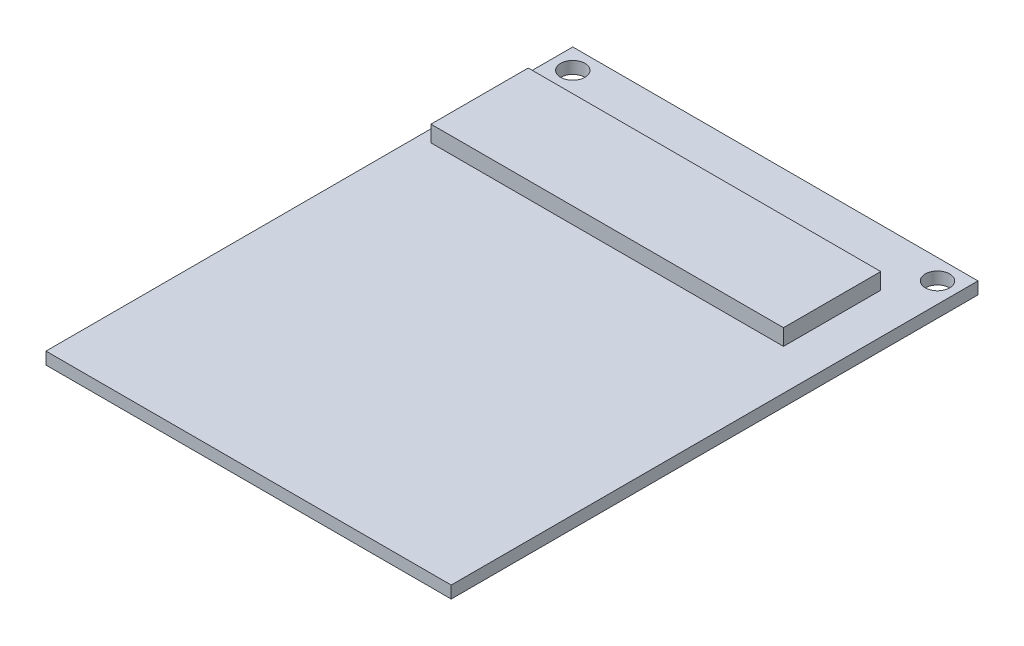
ISO-10303-21;
HEADER;
FILE_DESCRIPTION(('STEP AP214'),'2;1');
FILE_NAME('part.step','',(''),(''),'','','');
FILE_SCHEMA(('AUTOMOTIVE_DESIGN { 1 0 10303 214 1 1 1 1 }'));
ENDSEC;
DATA;
#1=APPLICATION_CONTEXT('core data for automotive mechanical design processes');
#2=APPLICATION_PROTOCOL_DEFINITION('international standard','automotive_design',2000,#1);
#3=PRODUCT_CONTEXT('',#1,'mechanical');
#4=PRODUCT('Part','Part','',(#3));
#5=PRODUCT_RELATED_PRODUCT_CATEGORY('part','',(#4));
#6=PRODUCT_DEFINITION_FORMATION('','',#4);
#7=PRODUCT_DEFINITION_CONTEXT('part definition',#1,'design');
#8=PRODUCT_DEFINITION('design','',#6,#7);
#9=PRODUCT_DEFINITION_SHAPE('','',#8);
#10=(LENGTH_UNIT() NAMED_UNIT(*) SI_UNIT(.MILLI.,.METRE.));
#11=(NAMED_UNIT(*) PLANE_ANGLE_UNIT() SI_UNIT($,.RADIAN.));
#12=(NAMED_UNIT(*) SI_UNIT($,.STERADIAN.) SOLID_ANGLE_UNIT());
#13=UNCERTAINTY_MEASURE_WITH_UNIT(LENGTH_MEASURE(1.E-05),#10,'distance_accuracy_value','');
#14=(GEOMETRIC_REPRESENTATION_CONTEXT(3) GLOBAL_UNCERTAINTY_ASSIGNED_CONTEXT((#13)) GLOBAL_UNIT_ASSIGNED_CONTEXT((#10,
#11,#12)) REPRESENTATION_CONTEXT('',''));
#15=CARTESIAN_POINT('',(0.,0.,0.));
#16=DIRECTION('',(0.,0.,1.));
#17=DIRECTION('',(1.,0.,0.));
#18=AXIS2_PLACEMENT_3D('',#15,#16,#17);
#19=CARTESIAN_POINT('',(0.,1.5,0.));
#20=DIRECTION('',(0.,0.,-1.));
#21=DIRECTION('',(-1.,0.,0.));
#22=AXIS2_PLACEMENT_3D('',#19,#20,#21);
#23=PLANE('',#22);
#24=DIRECTION('',(1.,0.,0.));
#25=VECTOR('',#24,1.);
#26=CARTESIAN_POINT('',(0.,0.,0.));
#27=LINE('',#26,#25);
#28=CARTESIAN_POINT('',(0.,0.,0.));
#29=VERTEX_POINT('',#28);
#30=CARTESIAN_POINT('',(50.,0.,0.));
#31=VERTEX_POINT('',#30);
#32=EDGE_CURVE('E122',#29,#31,#27,.T.);
#33=ORIENTED_EDGE('',*,*,#32,.T.);
#34=DIRECTION('',(0.,-1.,0.));
#35=VECTOR('',#34,1.);
#36=CARTESIAN_POINT('',(50.,1.5,0.));
#37=LINE('',#36,#35);
#38=CARTESIAN_POINT('',(50.,1.5,0.));
#39=VERTEX_POINT('',#38);
#40=EDGE_CURVE('E11',#39,#31,#37,.T.);
#41=ORIENTED_EDGE('',*,*,#40,.F.);
#42=DIRECTION('',(1.,0.,0.));
#43=VECTOR('',#42,1.);
#44=CARTESIAN_POINT('',(0.,1.5,0.));
#45=LINE('',#44,#43);
#46=CARTESIAN_POINT('',(0.,1.5,0.));
#47=VERTEX_POINT('',#46);
#48=EDGE_CURVE('E155',#47,#39,#45,.T.);
#49=ORIENTED_EDGE('',*,*,#48,.F.);
#50=DIRECTION('',(0.,-1.,0.));
#51=VECTOR('',#50,1.);
#52=CARTESIAN_POINT('',(0.,1.5,0.));
#53=LINE('',#52,#51);
#54=EDGE_CURVE('E62',#47,#29,#53,.T.);
#55=ORIENTED_EDGE('',*,*,#54,.T.);
#56=EDGE_LOOP('',(#33,#41,#49,#55));
#57=FACE_BOUND('',#56,.T.);
#58=ADVANCED_FACE('F39',(#57),#23,.F.);
#59=CARTESIAN_POINT('',(50.,1.5,0.));
#60=DIRECTION('',(-1.,0.,0.));
#61=DIRECTION('',(0.,0.,1.));
#62=AXIS2_PLACEMENT_3D('',#59,#60,#61);
#63=PLANE('',#62);
#64=DIRECTION('',(0.,0.,-1.));
#65=VECTOR('',#64,1.);
#66=CARTESIAN_POINT('',(50.,0.,0.));
#67=LINE('',#66,#65);
#68=CARTESIAN_POINT('',(50.,0.,-65.));
#69=VERTEX_POINT('',#68);
#70=EDGE_CURVE('E165',#31,#69,#67,.T.);
#71=ORIENTED_EDGE('',*,*,#70,.T.);
#72=DIRECTION('',(0.,-1.,0.));
#73=VECTOR('',#72,1.);
#74=CARTESIAN_POINT('',(50.,1.5,-65.));
#75=LINE('',#74,#73);
#76=CARTESIAN_POINT('',(50.,1.5,-65.));
#77=VERTEX_POINT('',#76);
#78=EDGE_CURVE('E46',#77,#69,#75,.T.);
#79=ORIENTED_EDGE('',*,*,#78,.F.);
#80=DIRECTION('',(0.,0.,-1.));
#81=VECTOR('',#80,1.);
#82=CARTESIAN_POINT('',(50.,1.5,0.));
#83=LINE('',#82,#81);
#84=EDGE_CURVE('E88',#39,#77,#83,.T.);
#85=ORIENTED_EDGE('',*,*,#84,.F.);
#86=ORIENTED_EDGE('',*,*,#40,.T.);
#87=EDGE_LOOP('',(#71,#79,#85,#86));
#88=FACE_BOUND('',#87,.T.);
#89=ADVANCED_FACE('F179',(#88),#63,.F.);
#90=CARTESIAN_POINT('',(0.,1.5,-65.));
#91=DIRECTION('',(0.,0.,-1.));
#92=DIRECTION('',(-1.,0.,0.));
#93=AXIS2_PLACEMENT_3D('',#90,#91,#92);
#94=PLANE('',#93);
#95=DIRECTION('',(1.,0.,0.));
#96=VECTOR('',#95,1.);
#97=CARTESIAN_POINT('',(0.,0.,-65.));
#98=LINE('',#97,#96);
#99=CARTESIAN_POINT('',(0.,0.,-65.));
#100=VERTEX_POINT('',#99);
#101=EDGE_CURVE('E168',#100,#69,#98,.T.);
#102=ORIENTED_EDGE('',*,*,#101,.F.);
#103=DIRECTION('',(0.,-1.,0.));
#104=VECTOR('',#103,1.);
#105=CARTESIAN_POINT('',(0.,1.5,-65.));
#106=LINE('',#105,#104);
#107=CARTESIAN_POINT('',(0.,1.5,-65.));
#108=VERTEX_POINT('',#107);
#109=EDGE_CURVE('E174',#108,#100,#106,.T.);
#110=ORIENTED_EDGE('',*,*,#109,.F.);
#111=DIRECTION('',(1.,0.,0.));
#112=VECTOR('',#111,1.);
#113=CARTESIAN_POINT('',(0.,1.5,-65.));
#114=LINE('',#113,#112);
#115=EDGE_CURVE('E159',#108,#77,#114,.T.);
#116=ORIENTED_EDGE('',*,*,#115,.T.);
#117=ORIENTED_EDGE('',*,*,#78,.T.);
#118=EDGE_LOOP('',(#102,#110,#116,#117));
#119=FACE_BOUND('',#118,.T.);
#120=ADVANCED_FACE('F177',(#119),#94,.T.);
#121=CARTESIAN_POINT('',(0.,1.5,0.));
#122=DIRECTION('',(-1.,0.,0.));
#123=DIRECTION('',(0.,0.,1.));
#124=AXIS2_PLACEMENT_3D('',#121,#122,#123);
#125=PLANE('',#124);
#126=DIRECTION('',(0.,0.,-1.));
#127=VECTOR('',#126,1.);
#128=CARTESIAN_POINT('',(0.,0.,0.));
#129=LINE('',#128,#127);
#130=EDGE_CURVE('E157',#29,#100,#129,.T.);
#131=ORIENTED_EDGE('',*,*,#130,.F.);
#132=ORIENTED_EDGE('',*,*,#54,.F.);
#133=DIRECTION('',(0.,0.,-1.));
#134=VECTOR('',#133,1.);
#135=CARTESIAN_POINT('',(0.,1.5,0.));
#136=LINE('',#135,#134);
#137=EDGE_CURVE('E162',#47,#108,#136,.T.);
#138=ORIENTED_EDGE('',*,*,#137,.T.);
#139=ORIENTED_EDGE('',*,*,#109,.T.);
#140=EDGE_LOOP('',(#131,#132,#138,#139));
#141=FACE_BOUND('',#140,.T.);
#142=ADVANCED_FACE('F183',(#141),#125,.T.);
#143=CARTESIAN_POINT('',(0.,1.5,0.));
#144=DIRECTION('',(0.,1.,0.));
#145=DIRECTION('',(0.,0.,1.));
#146=AXIS2_PLACEMENT_3D('',#143,#144,#145);
#147=PLANE('',#146);
#148=CARTESIAN_POINT('',(2.5,1.5,-62.5));
#149=DIRECTION('',(0.,1.,0.));
#150=DIRECTION('',(0.,0.,1.));
#151=AXIS2_PLACEMENT_3D('',#148,#149,#150);
#152=CIRCLE('',#151,1.5);
#153=CARTESIAN_POINT('',(2.5,1.5,-61.));
#154=VERTEX_POINT('',#153);
#155=EDGE_CURVE('E231',#154,#154,#152,.T.);
#156=ORIENTED_EDGE('',*,*,#155,.F.);
#157=EDGE_LOOP('',(#156));
#158=FACE_BOUND('',#157,.T.);
#159=CARTESIAN_POINT('',(47.5,1.5,-62.5));
#160=DIRECTION('',(0.,1.,0.));
#161=DIRECTION('',(0.,0.,1.));
#162=AXIS2_PLACEMENT_3D('',#159,#160,#161);
#163=CIRCLE('',#162,1.5);
#164=CARTESIAN_POINT('',(47.5,1.5,-61.));
#165=VERTEX_POINT('',#164);
#166=EDGE_CURVE('E141',#165,#165,#163,.T.);
#167=ORIENTED_EDGE('',*,*,#166,.F.);
#168=EDGE_LOOP('',(#167));
#169=FACE_BOUND('',#168,.T.);
#170=DIRECTION('',(0.,0.,-1.));
#171=VECTOR('',#170,1.);
#172=CARTESIAN_POINT('',(1.50000000000001,1.5,0.));
#173=LINE('',#172,#171);
#174=CARTESIAN_POINT('',(1.5,1.5,-46.));
#175=VERTEX_POINT('',#174);
#176=CARTESIAN_POINT('',(1.5,1.5,-58.));
#177=VERTEX_POINT('',#176);
#178=EDGE_CURVE('E119',#175,#177,#173,.T.);
#179=ORIENTED_EDGE('',*,*,#178,.T.);
#180=DIRECTION('',(-1.,0.,0.));
#181=VECTOR('',#180,1.);
#182=CARTESIAN_POINT('',(0.,1.5,-58.));
#183=LINE('',#182,#181);
#184=CARTESIAN_POINT('',(45.,1.5,-58.));
#185=VERTEX_POINT('',#184);
#186=EDGE_CURVE('E136',#185,#177,#183,.T.);
#187=ORIENTED_EDGE('',*,*,#186,.F.);
#188=DIRECTION('',(0.,0.,-1.));
#189=VECTOR('',#188,1.);
#190=CARTESIAN_POINT('',(45.,1.5,0.));
#191=LINE('',#190,#189);
#192=CARTESIAN_POINT('',(45.,1.5,-46.));
#193=VERTEX_POINT('',#192);
#194=EDGE_CURVE('E138',#193,#185,#191,.T.);
#195=ORIENTED_EDGE('',*,*,#194,.F.);
#196=DIRECTION('',(1.,0.,0.));
#197=VECTOR('',#196,1.);
#198=CARTESIAN_POINT('',(0.,1.5,-46.));
#199=LINE('',#198,#197);
#200=EDGE_CURVE('E148',#175,#193,#199,.T.);
#201=ORIENTED_EDGE('',*,*,#200,.F.);
#202=EDGE_LOOP('',(#179,#187,#195,#201));
#203=FACE_BOUND('',#202,.T.);
#204=ORIENTED_EDGE('',*,*,#48,.T.);
#205=ORIENTED_EDGE('',*,*,#84,.T.);
#206=ORIENTED_EDGE('',*,*,#115,.F.);
#207=ORIENTED_EDGE('',*,*,#137,.F.);
#208=EDGE_LOOP('',(#204,#205,#206,#207));
#209=FACE_BOUND('',#208,.T.);
#210=ADVANCED_FACE('F186',(#158,#169,#203,#209),#147,.T.);
#211=CARTESIAN_POINT('',(0.,0.,0.));
#212=DIRECTION('',(0.,1.,0.));
#213=DIRECTION('',(0.,0.,1.));
#214=AXIS2_PLACEMENT_3D('',#211,#212,#213);
#215=PLANE('',#214);
#216=CARTESIAN_POINT('',(2.5,0.,-62.5));
#217=DIRECTION('',(0.,1.,0.));
#218=DIRECTION('',(0.,0.,1.));
#219=AXIS2_PLACEMENT_3D('',#216,#217,#218);
#220=CIRCLE('',#219,1.5);
#221=CARTESIAN_POINT('',(2.5,0.,-61.));
#222=VERTEX_POINT('',#221);
#223=EDGE_CURVE('E149',#222,#222,#220,.F.);
#224=ORIENTED_EDGE('',*,*,#223,.F.);
#225=EDGE_LOOP('',(#224));
#226=FACE_BOUND('',#225,.T.);
#227=CARTESIAN_POINT('',(47.5,0.,-62.5));
#228=DIRECTION('',(0.,1.,0.));
#229=DIRECTION('',(0.,0.,1.));
#230=AXIS2_PLACEMENT_3D('',#227,#228,#229);
#231=CIRCLE('',#230,1.5);
#232=CARTESIAN_POINT('',(47.5,0.,-61.));
#233=VERTEX_POINT('',#232);
#234=EDGE_CURVE('E235',#233,#233,#231,.F.);
#235=ORIENTED_EDGE('',*,*,#234,.F.);
#236=EDGE_LOOP('',(#235));
#237=FACE_BOUND('',#236,.T.);
#238=ORIENTED_EDGE('',*,*,#32,.F.);
#239=ORIENTED_EDGE('',*,*,#130,.T.);
#240=ORIENTED_EDGE('',*,*,#101,.T.);
#241=ORIENTED_EDGE('',*,*,#70,.F.);
#242=EDGE_LOOP('',(#238,#239,#240,#241));
#243=FACE_BOUND('',#242,.T.);
#244=ADVANCED_FACE('F182',(#226,#237,#243),#215,.F.);
#245=CARTESIAN_POINT('',(1.50000000000001,3.5,0.));
#246=DIRECTION('',(-1.,0.,0.));
#247=DIRECTION('',(0.,0.,1.));
#248=AXIS2_PLACEMENT_3D('',#245,#246,#247);
#249=PLANE('',#248);
#250=ORIENTED_EDGE('',*,*,#178,.F.);
#251=DIRECTION('',(0.,-1.,0.));
#252=VECTOR('',#251,1.);
#253=CARTESIAN_POINT('',(1.5,3.5,-46.));
#254=LINE('',#253,#252);
#255=CARTESIAN_POINT('',(1.5,3.5,-46.));
#256=VERTEX_POINT('',#255);
#257=EDGE_CURVE('E113',#256,#175,#254,.T.);
#258=ORIENTED_EDGE('',*,*,#257,.F.);
#259=DIRECTION('',(0.,0.,-1.));
#260=VECTOR('',#259,1.);
#261=CARTESIAN_POINT('',(1.50000000000001,3.5,0.));
#262=LINE('',#261,#260);
#263=CARTESIAN_POINT('',(1.5,3.5,-58.));
#264=VERTEX_POINT('',#263);
#265=EDGE_CURVE('E117',#256,#264,#262,.T.);
#266=ORIENTED_EDGE('',*,*,#265,.T.);
#267=DIRECTION('',(0.,-1.,0.));
#268=VECTOR('',#267,1.);
#269=CARTESIAN_POINT('',(1.5,3.5,-58.));
#270=LINE('',#269,#268);
#271=EDGE_CURVE('E146',#264,#177,#270,.T.);
#272=ORIENTED_EDGE('',*,*,#271,.T.);
#273=EDGE_LOOP('',(#250,#258,#266,#272));
#274=FACE_BOUND('',#273,.T.);
#275=ADVANCED_FACE('F115',(#274),#249,.T.);
#276=CARTESIAN_POINT('',(0.,3.5,-46.));
#277=DIRECTION('',(0.,0.,-1.));
#278=DIRECTION('',(-1.,0.,0.));
#279=AXIS2_PLACEMENT_3D('',#276,#277,#278);
#280=PLANE('',#279);
#281=ORIENTED_EDGE('',*,*,#200,.T.);
#282=DIRECTION('',(0.,-1.,0.));
#283=VECTOR('',#282,1.);
#284=CARTESIAN_POINT('',(45.,3.5,-46.));
#285=LINE('',#284,#283);
#286=CARTESIAN_POINT('',(45.,3.5,-46.));
#287=VERTEX_POINT('',#286);
#288=EDGE_CURVE('E123',#287,#193,#285,.T.);
#289=ORIENTED_EDGE('',*,*,#288,.F.);
#290=DIRECTION('',(1.,0.,0.));
#291=VECTOR('',#290,1.);
#292=CARTESIAN_POINT('',(0.,3.5,-46.));
#293=LINE('',#292,#291);
#294=EDGE_CURVE('E126',#256,#287,#293,.T.);
#295=ORIENTED_EDGE('',*,*,#294,.F.);
#296=ORIENTED_EDGE('',*,*,#257,.T.);
#297=EDGE_LOOP('',(#281,#289,#295,#296));
#298=FACE_BOUND('',#297,.T.);
#299=ADVANCED_FACE('F127',(#298),#280,.F.);
#300=CARTESIAN_POINT('',(45.,3.5,0.));
#301=DIRECTION('',(-1.,0.,0.));
#302=DIRECTION('',(0.,0.,1.));
#303=AXIS2_PLACEMENT_3D('',#300,#301,#302);
#304=PLANE('',#303);
#305=ORIENTED_EDGE('',*,*,#194,.T.);
#306=DIRECTION('',(0.,-1.,0.));
#307=VECTOR('',#306,1.);
#308=CARTESIAN_POINT('',(45.,3.5,-58.));
#309=LINE('',#308,#307);
#310=CARTESIAN_POINT('',(45.,3.5,-58.));
#311=VERTEX_POINT('',#310);
#312=EDGE_CURVE('E53',#311,#185,#309,.T.);
#313=ORIENTED_EDGE('',*,*,#312,.F.);
#314=DIRECTION('',(0.,0.,-1.));
#315=VECTOR('',#314,1.);
#316=CARTESIAN_POINT('',(45.,3.5,0.));
#317=LINE('',#316,#315);
#318=EDGE_CURVE('E131',#287,#311,#317,.T.);
#319=ORIENTED_EDGE('',*,*,#318,.F.);
#320=ORIENTED_EDGE('',*,*,#288,.T.);
#321=EDGE_LOOP('',(#305,#313,#319,#320));
#322=FACE_BOUND('',#321,.T.);
#323=ADVANCED_FACE('F208',(#322),#304,.F.);
#324=CARTESIAN_POINT('',(0.,3.5,-58.));
#325=DIRECTION('',(0.,0.,1.));
#326=DIRECTION('',(1.,0.,0.));
#327=AXIS2_PLACEMENT_3D('',#324,#325,#326);
#328=PLANE('',#327);
#329=ORIENTED_EDGE('',*,*,#186,.T.);
#330=ORIENTED_EDGE('',*,*,#271,.F.);
#331=DIRECTION('',(-1.,0.,0.));
#332=VECTOR('',#331,1.);
#333=CARTESIAN_POINT('',(0.,3.5,-58.));
#334=LINE('',#333,#332);
#335=EDGE_CURVE('E134',#311,#264,#334,.T.);
#336=ORIENTED_EDGE('',*,*,#335,.F.);
#337=ORIENTED_EDGE('',*,*,#312,.T.);
#338=EDGE_LOOP('',(#329,#330,#336,#337));
#339=FACE_BOUND('',#338,.T.);
#340=ADVANCED_FACE('F211',(#339),#328,.F.);
#341=CARTESIAN_POINT('',(0.,3.5,0.));
#342=DIRECTION('',(0.,1.,0.));
#343=DIRECTION('',(0.,0.,1.));
#344=AXIS2_PLACEMENT_3D('',#341,#342,#343);
#345=PLANE('',#344);
#346=ORIENTED_EDGE('',*,*,#265,.F.);
#347=ORIENTED_EDGE('',*,*,#294,.T.);
#348=ORIENTED_EDGE('',*,*,#318,.T.);
#349=ORIENTED_EDGE('',*,*,#335,.T.);
#350=EDGE_LOOP('',(#346,#347,#348,#349));
#351=FACE_BOUND('',#350,.T.);
#352=ADVANCED_FACE('F133',(#351),#345,.T.);
#353=CARTESIAN_POINT('',(47.5,-4.24264068711929,-62.5));
#354=DIRECTION('',(0.,1.,0.));
#355=DIRECTION('',(0.,0.,1.));
#356=AXIS2_PLACEMENT_3D('',#353,#354,#355);
#357=CYLINDRICAL_SURFACE('',#356,1.5);
#358=ORIENTED_EDGE('',*,*,#234,.T.);
#359=EDGE_LOOP('',(#358));
#360=FACE_BOUND('',#359,.T.);
#361=ORIENTED_EDGE('',*,*,#166,.T.);
#362=EDGE_LOOP('',(#361));
#363=FACE_BOUND('',#362,.T.);
#364=ADVANCED_FACE('F217',(#360,#363),#357,.F.);
#365=CARTESIAN_POINT('',(2.5,-4.24264068711929,-62.5));
#366=DIRECTION('',(0.,1.,0.));
#367=DIRECTION('',(0.,0.,1.));
#368=AXIS2_PLACEMENT_3D('',#365,#366,#367);
#369=CYLINDRICAL_SURFACE('',#368,1.5);
#370=ORIENTED_EDGE('',*,*,#223,.T.);
#371=EDGE_LOOP('',(#370));
#372=FACE_BOUND('',#371,.T.);
#373=ORIENTED_EDGE('',*,*,#155,.T.);
#374=EDGE_LOOP('',(#373));
#375=FACE_BOUND('',#374,.T.);
#376=ADVANCED_FACE('F220',(#372,#375),#369,.F.);
#377=CLOSED_SHELL('',(#58,#89,#120,#142,#210,#244,#275,#299,#323,#340,#352,#364,#376));
#378=MANIFOLD_SOLID_BREP('B2',#377);
#379=ADVANCED_BREP_SHAPE_REPRESENTATION('',(#18,#378),#14);
#380=SHAPE_DEFINITION_REPRESENTATION(#9,#379);
ENDSEC;
END-ISO-10303-21;
